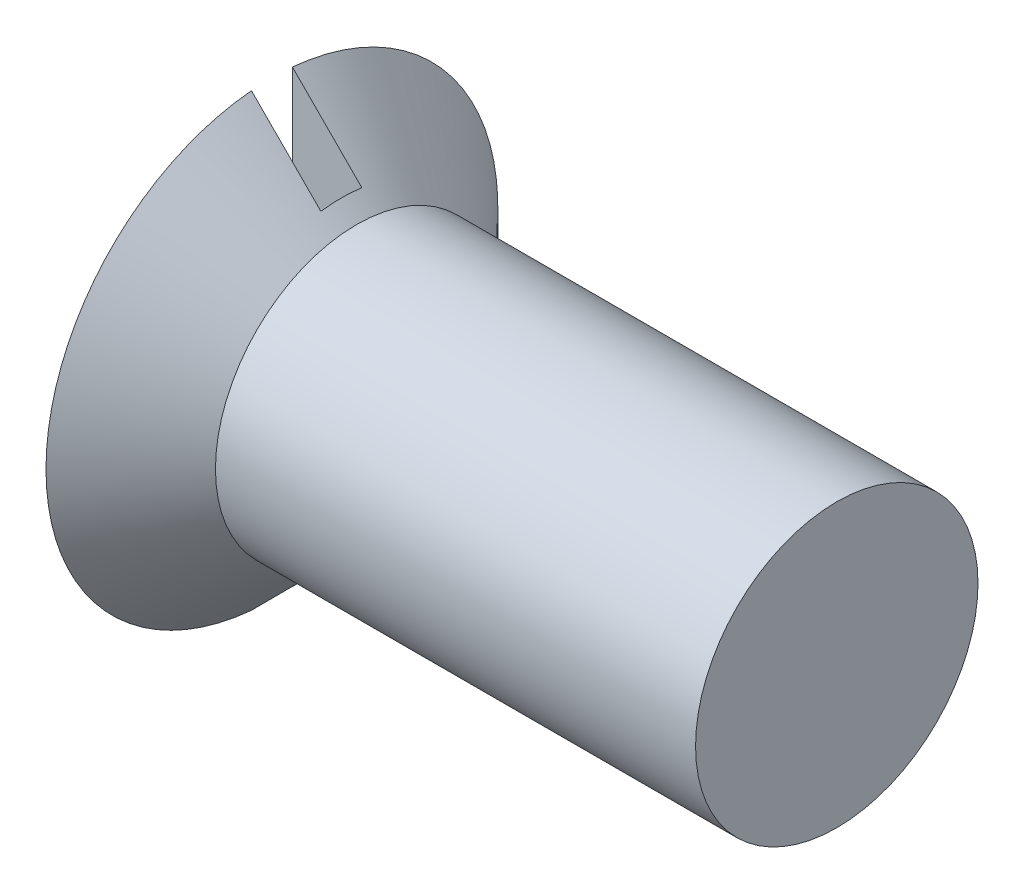
ISO-10303-21;
HEADER;
FILE_DESCRIPTION(('STEP AP214'),'2;1');
FILE_NAME('part.step','',(''),(''),'','','');
FILE_SCHEMA(('AUTOMOTIVE_DESIGN { 1 0 10303 214 1 1 1 1 }'));
ENDSEC;
DATA;
#1=APPLICATION_CONTEXT('core data for automotive mechanical design processes');
#2=APPLICATION_PROTOCOL_DEFINITION('international standard','automotive_design',2000,#1);
#3=PRODUCT_CONTEXT('',#1,'mechanical');
#4=PRODUCT('Part','Part','',(#3));
#5=PRODUCT_RELATED_PRODUCT_CATEGORY('part','',(#4));
#6=PRODUCT_DEFINITION_FORMATION('','',#4);
#7=PRODUCT_DEFINITION_CONTEXT('part definition',#1,'design');
#8=PRODUCT_DEFINITION('design','',#6,#7);
#9=PRODUCT_DEFINITION_SHAPE('','',#8);
#10=(LENGTH_UNIT() NAMED_UNIT(*) SI_UNIT(.MILLI.,.METRE.));
#11=(NAMED_UNIT(*) PLANE_ANGLE_UNIT() SI_UNIT($,.RADIAN.));
#12=(NAMED_UNIT(*) SI_UNIT($,.STERADIAN.) SOLID_ANGLE_UNIT());
#13=UNCERTAINTY_MEASURE_WITH_UNIT(LENGTH_MEASURE(1.E-05),#10,'distance_accuracy_value','');
#14=(GEOMETRIC_REPRESENTATION_CONTEXT(3) GLOBAL_UNCERTAINTY_ASSIGNED_CONTEXT((#13)) GLOBAL_UNIT_ASSIGNED_CONTEXT((#10,
#11,#12)) REPRESENTATION_CONTEXT('',''));
#15=CARTESIAN_POINT('',(0.,0.,0.));
#16=DIRECTION('',(0.,0.,1.));
#17=DIRECTION('',(1.,0.,0.));
#18=AXIS2_PLACEMENT_3D('',#15,#16,#17);
#19=CARTESIAN_POINT('',(0.,5.08,0.));
#20=DIRECTION('',(1.,0.,0.));
#21=DIRECTION('',(0.,0.,-1.));
#22=AXIS2_PLACEMENT_3D('',#19,#20,#21);
#23=PLANE('',#22);
#24=CARTESIAN_POINT('',(0.,0.,0.));
#25=DIRECTION('',(-1.,0.,0.));
#26=DIRECTION('',(0.,0.,1.));
#27=AXIS2_PLACEMENT_3D('',#24,#25,#26);
#28=CIRCLE('',#27,5.08);
#29=CARTESIAN_POINT('',(0.,-5.05909323698833,0.460408100991862));
#30=VERTEX_POINT('',#29);
#31=CARTESIAN_POINT('',(0.,5.05909323698833,0.460408100991862));
#32=VERTEX_POINT('',#31);
#33=EDGE_CURVE('E128',#30,#32,#28,.T.);
#34=ORIENTED_EDGE('',*,*,#33,.T.);
#35=DIRECTION('',(0.,-1.,0.));
#36=VECTOR('',#35,1.);
#37=CARTESIAN_POINT('',(0.,5.08,0.460408100991862));
#38=LINE('',#37,#36);
#39=EDGE_CURVE('E129',#32,#30,#38,.T.);
#40=ORIENTED_EDGE('',*,*,#39,.T.);
#41=EDGE_LOOP('',(#34,#40));
#42=FACE_BOUND('',#41,.T.);
#43=ADVANCED_FACE('F34',(#42),#23,.F.);
#44=CARTESIAN_POINT('',(0.,5.05909323698833,-0.460408100991862));
#45=VERTEX_POINT('',#44);
#46=CARTESIAN_POINT('',(0.,-5.05909323698833,-0.460408100991862));
#47=VERTEX_POINT('',#46);
#48=EDGE_CURVE('E130',#45,#47,#28,.T.);
#49=ORIENTED_EDGE('',*,*,#48,.T.);
#50=DIRECTION('',(0.,1.,0.));
#51=VECTOR('',#50,1.);
#52=CARTESIAN_POINT('',(0.,5.08,-0.460408100991862));
#53=LINE('',#52,#51);
#54=EDGE_CURVE('E55',#47,#45,#53,.T.);
#55=ORIENTED_EDGE('',*,*,#54,.T.);
#56=EDGE_LOOP('',(#49,#55));
#57=FACE_BOUND('',#56,.T.);
#58=ADVANCED_FACE('F36',(#57),#23,.F.);
#59=CARTESIAN_POINT('',(12.7,0.,0.));
#60=DIRECTION('',(-1.,0.,0.));
#61=DIRECTION('',(0.,0.,1.));
#62=AXIS2_PLACEMENT_3D('',#59,#60,#61);
#63=PLANE('',#62);
#64=CARTESIAN_POINT('',(12.7,0.,0.));
#65=DIRECTION('',(-1.,0.,0.));
#66=DIRECTION('',(0.,0.,1.));
#67=AXIS2_PLACEMENT_3D('',#64,#65,#66);
#68=CIRCLE('',#67,3.175);
#69=CARTESIAN_POINT('',(12.7,0.,3.175));
#70=VERTEX_POINT('',#69);
#71=EDGE_CURVE('E89',#70,#70,#68,.T.);
#72=ORIENTED_EDGE('',*,*,#71,.F.);
#73=EDGE_LOOP('',(#72));
#74=FACE_BOUND('',#73,.T.);
#75=ADVANCED_FACE('F125',(#74),#63,.F.);
#76=CARTESIAN_POINT('',(0.,0.,0.));
#77=DIRECTION('',(-1.,0.,0.));
#78=DIRECTION('',(0.,0.,1.));
#79=AXIS2_PLACEMENT_3D('',#76,#77,#78);
#80=CYLINDRICAL_SURFACE('',#79,3.175);
#81=CARTESIAN_POINT('',(1.905,0.,0.));
#82=DIRECTION('',(-1.,0.,0.));
#83=DIRECTION('',(0.,0.,1.));
#84=AXIS2_PLACEMENT_3D('',#81,#82,#83);
#85=CIRCLE('',#84,3.17499999999999);
#86=CARTESIAN_POINT('',(1.905,0.,3.17499999999999));
#87=VERTEX_POINT('',#86);
#88=EDGE_CURVE('E132',#87,#87,#85,.T.);
#89=ORIENTED_EDGE('',*,*,#88,.F.);
#90=EDGE_LOOP('',(#89));
#91=FACE_BOUND('',#90,.T.);
#92=ORIENTED_EDGE('',*,*,#71,.T.);
#93=EDGE_LOOP('',(#92));
#94=FACE_BOUND('',#93,.T.);
#95=ADVANCED_FACE('F119',(#91,#94),#80,.T.);
#96=CARTESIAN_POINT('',(1.905,0.,0.));
#97=DIRECTION('',(-1.,0.,0.));
#98=DIRECTION('',(0.,0.,1.));
#99=AXIS2_PLACEMENT_3D('',#96,#97,#98);
#100=CONICAL_SURFACE('',#99,3.17499999999999,0.78539816339745);
#101=CARTESIAN_POINT('',(1.55955971614929,0.,0.));
#102=DIRECTION('',(1.,0.,0.));
#103=DIRECTION('',(0.,0.,-1.));
#104=AXIS2_PLACEMENT_3D('',#101,#102,#103);
#105=CIRCLE('',#104,3.5204402838507);
#106=CARTESIAN_POINT('',(1.55955971614929,3.49020403023947,-0.460408100991862));
#107=VERTEX_POINT('',#106);
#108=CARTESIAN_POINT('',(1.55955971614929,3.49020403023947,0.460408100991862));
#109=VERTEX_POINT('',#108);
#110=EDGE_CURVE('E48',#107,#109,#105,.T.);
#111=ORIENTED_EDGE('',*,*,#110,.T.);
#112=CARTESIAN_POINT('',(-6.16759957704743,-11.2381724771485,0.460408100991862));
#113=CARTESIAN_POINT('',(-5.7784119867717,-10.8486556532235,0.460408100991862));
#114=CARTESIAN_POINT('',(-5.3892387700687,-10.4591244622243,0.460408100991862));
#115=CARTESIAN_POINT('',(-4.61093896086825,-9.68001314754672,0.460408100991862));
#116=CARTESIAN_POINT('',(-4.22181236851561,-9.2904330237236,0.460408100991862));
#117=CARTESIAN_POINT('',(-3.44359906342399,-8.51117898866716,0.460408100991862));
#118=CARTESIAN_POINT('',(-3.05451235532124,-8.12150507280372,0.460408100991862));
#119=CARTESIAN_POINT('',(-2.27644162031222,-7.3420570199807,0.460408100991862));
#120=CARTESIAN_POINT('',(-1.88745759310645,-6.95228288332012,0.460408100991862));
#121=CARTESIAN_POINT('',(-1.11190208062278,-6.17482055208817,0.460408100991862));
#122=CARTESIAN_POINT('',(-0.725329637753959,-5.78713331270981,0.460408100991862));
#123=CARTESIAN_POINT('',(0.0475349379208825,-5.01147268435745,0.460408100991862));
#124=CARTESIAN_POINT('',(0.433827068284316,-4.62349929294801,0.460408100991862));
#125=CARTESIAN_POINT('',(1.01280798322811,-4.04110120514328,0.460408100991862));
#126=CARTESIAN_POINT('',(1.20572125718688,-3.84689969740992,0.460408100991862));
#127=CARTESIAN_POINT('',(1.59131204025218,-3.45826123068062,0.460408100991862));
#128=CARTESIAN_POINT('',(1.78398954854388,-3.26382427087552,0.460408100991862));
#129=CARTESIAN_POINT('',(2.16894415175285,-2.87456066094923,0.460408100991862));
#130=CARTESIAN_POINT('',(2.3612212529949,-2.67973401708021,0.460408100991862));
#131=CARTESIAN_POINT('',(2.74506510097304,-2.28938251795239,0.460408100991862));
#132=CARTESIAN_POINT('',(2.93663185314031,-2.09385766805446,0.460408100991862));
#133=CARTESIAN_POINT('',(3.17971244123445,-1.84371016327747,0.460408100991862));
#134=CARTESIAN_POINT('',(3.23197070990426,-1.78981143164895,0.460408100991862));
#135=CARTESIAN_POINT('',(3.33632195024125,-1.68185375060645,0.460408100991862));
#136=CARTESIAN_POINT('',(3.3884149213582,-1.62779480066031,0.460408100991862));
#137=CARTESIAN_POINT('',(3.49242927847795,-1.51941988841599,0.460408100991862));
#138=CARTESIAN_POINT('',(3.54435047149384,-1.46510374079834,0.460408100991862));
#139=CARTESIAN_POINT('',(3.64789277407434,-1.35618633215652,0.460408100991862));
#140=CARTESIAN_POINT('',(3.69951388566574,-1.30158507306279,0.460408100991862));
#141=CARTESIAN_POINT('',(3.8197744640083,-1.17338946379339,0.460408100991862));
#142=CARTESIAN_POINT('',(3.88824523703887,-1.09963686784403,0.460408100991862));
#143=CARTESIAN_POINT('',(4.02379587684333,-0.951074370710247,0.460408100991862));
#144=CARTESIAN_POINT('',(4.09087787413187,-0.876266439410587,0.460408100991862));
#145=CARTESIAN_POINT('',(4.19901572297908,-0.751490592309714,0.460408100991862));
#146=CARTESIAN_POINT('',(4.2408233820252,-0.702175910638047,0.460408100991862));
#147=CARTESIAN_POINT('',(4.32284224156223,-0.601810747087484,0.460408100991862));
#148=CARTESIAN_POINT('',(4.3630449299683,-0.550753141964238,0.460408100991862));
#149=CARTESIAN_POINT('',(4.4209325333439,-0.471920279895036,0.460408100991862));
#150=CARTESIAN_POINT('',(4.43992473391601,-0.445112263829037,0.460408100991862));
#151=CARTESIAN_POINT('',(4.47659166252188,-0.390560520251965,0.460408100991862));
#152=CARTESIAN_POINT('',(4.4942650970993,-0.362815911865659,0.460408100991862));
#153=CARTESIAN_POINT('',(4.52747836810241,-0.306307005868655,0.460408100991862));
#154=CARTESIAN_POINT('',(4.54303187016757,-0.277550906166514,0.460408100991862));
#155=CARTESIAN_POINT('',(4.57100051735079,-0.218579898386271,0.460408100991862));
#156=CARTESIAN_POINT('',(4.58342284205831,-0.188368520338824,0.460408100991862));
#157=CARTESIAN_POINT('',(4.60331638465681,-0.126805252346718,0.460408100991862));
#158=CARTESIAN_POINT('',(4.61086461470696,-0.095479797355971,0.460408100991862));
#159=CARTESIAN_POINT('',(4.61953053864308,-0.0320460520175875,0.460408100991862));
#160=CARTESIAN_POINT('',(4.62068175534835,5.72701904688987E-05,0.460408100991862));
#161=CARTESIAN_POINT('',(4.61629661370954,0.063711312619772,0.460408100991862));
#162=CARTESIAN_POINT('',(4.61077100753414,0.0952628385191108,0.460408100991862));
#163=CARTESIAN_POINT('',(4.59445994772262,0.157089291990153,0.460408100991862));
#164=CARTESIAN_POINT('',(4.58364116806406,0.187354792807354,0.460408100991862));
#165=CARTESIAN_POINT('',(4.5542161053928,0.256448685947123,0.460408100991862));
#166=CARTESIAN_POINT('',(4.53421164865229,0.294657447522127,0.460408100991862));
#167=CARTESIAN_POINT('',(4.4906992263566,0.369062990790539,0.460408100991862));
#168=CARTESIAN_POINT('',(4.4671816958368,0.405253897122974,0.460408100991862));
#169=CARTESIAN_POINT('',(4.41793960528131,0.476456488218595,0.460408100991862));
#170=CARTESIAN_POINT('',(4.39220081035695,0.511458200641449,0.460408100991862));
#171=CARTESIAN_POINT('',(4.33947830020312,0.580420040686141,0.460408100991862));
#172=CARTESIAN_POINT('',(4.31249639088604,0.614381566928726,0.460408100991862));
#173=CARTESIAN_POINT('',(4.25299046907636,0.687379173372127,0.460408100991862));
#174=CARTESIAN_POINT('',(4.22030954870873,0.726286718146369,0.460408100991862));
#175=CARTESIAN_POINT('',(4.15419024328488,0.803454604731398,0.460408100991862));
#176=CARTESIAN_POINT('',(4.12075179066361,0.84171488827649,0.460408100991862));
#177=CARTESIAN_POINT('',(4.01965246432327,0.955837308105514,0.460408100991862));
#178=CARTESIAN_POINT('',(3.95122583870824,1.03101930294387,0.460408100991862));
#179=CARTESIAN_POINT('',(3.81322094348089,1.18048983900892,0.460408100991862));
#180=CARTESIAN_POINT('',(3.74364129597729,1.25477709571764,0.460408100991862));
#181=CARTESIAN_POINT('',(3.60384592027768,1.40272656036384,0.460408100991862));
#182=CARTESIAN_POINT('',(3.53363030175075,1.47638887198036,0.460408100991862));
#183=CARTESIAN_POINT('',(3.39316683740419,1.6229172288353,0.460408100991862));
#184=CARTESIAN_POINT('',(3.32292123097084,1.69578542589778,0.460408100991862));
#185=CARTESIAN_POINT('',(3.18214528628746,1.84125235809043,0.460408100991862));
#186=CARTESIAN_POINT('',(3.11161493555662,1.91385108113543,0.460408100991862));
#187=CARTESIAN_POINT('',(2.89982305932339,2.13126258434928,0.460408100991862));
#188=CARTESIAN_POINT('',(2.75826684227279,2.27578810922424,0.460408100991862));
#189=CARTESIAN_POINT('',(2.47483027457952,2.56430172122673,0.460408100991862));
#190=CARTESIAN_POINT('',(2.33295025723575,2.70829013636859,0.460408100991862));
#191=CARTESIAN_POINT('',(2.04891788455687,2.99599818848075,0.460408100991862));
#192=CARTESIAN_POINT('',(1.90676552909126,3.13971782532219,0.460408100991862));
#193=CARTESIAN_POINT('',(1.48004407898709,3.57061952591904,0.460408100991862));
#194=CARTESIAN_POINT('',(1.19521295471136,3.85754199102035,0.460408100991862));
#195=CARTESIAN_POINT('',(0.625136199464497,4.43111735381693,0.460408100991862));
#196=CARTESIAN_POINT('',(0.339890482572417,4.71777016604156,0.460408100991862));
#197=CARTESIAN_POINT('',(-0.230802850103447,5.29087294589003,0.460408100991862));
#198=CARTESIAN_POINT('',(-0.51625046525227,5.57732291414618,0.460408100991862));
#199=CARTESIAN_POINT('',(-1.37359098569651,6.43730629424596,0.460408100991862));
#200=CARTESIAN_POINT('',(-1.94566820840955,7.01065591931271,0.460408100991862));
#201=CARTESIAN_POINT('',(-3.0900104524797,8.15709762223212,0.460408100991862));
#202=CARTESIAN_POINT('',(-3.66227546020379,8.7301897136971,0.460408100991862));
#203=CARTESIAN_POINT('',(-4.39571942885791,9.46453088890552,0.460408100991862));
#204=CARTESIAN_POINT('',(-4.5568399017116,9.62583838916599,0.460408100991862));
#205=CARTESIAN_POINT('',(-4.87909145357073,9.94844635391253,0.460408100991862));
#206=CARTESIAN_POINT('',(-5.04022253267364,10.1097468183012,0.460408100991862));
#207=CARTESIAN_POINT('',(-5.36239170240464,10.4322394952848,0.460408100991862));
#208=CARTESIAN_POINT('',(-5.52342978830001,10.5934317126077,0.460408100991862));
#209=CARTESIAN_POINT('',(-5.84551082356545,10.9158077298135,0.460408100991862));
#210=CARTESIAN_POINT('',(-6.00655377286214,11.0769915297698,0.460408100991862));
#211=CARTESIAN_POINT('',(-6.16759957704743,11.2381724771485,0.460408100991862));
#212=B_SPLINE_CURVE_WITH_KNOTS('',3,(#112,#113,#114,#115,#116,#117,#118,#119,#120,#121,#122,
#123,#124,#125,#126,#127,#128,#129,#130,#131,#132,#133,#134,#135,#136,#137,#138,#139,#140,#141,
#142,#143,#144,#145,#146,#147,#148,#149,#150,#151,#152,#153,#154,#155,#156,#157,#158,#159,#160,
#161,#162,#163,#164,#165,#166,#167,#168,#169,#170,#171,#172,#173,#174,#175,#176,#177,#178,#179,
#180,#181,#182,#183,#184,#185,#186,#187,#188,#189,#190,#191,#192,#193,#194,#195,#196,#197,#198,
#199,#200,#201,#202,#203,#204,#205,#206,#207,#208,#209,#210,#211),.UNSPECIFIED.,.F.,.F.,(4,2,2,
2,2,2,2,2,2,2,2,2,2,2,2,2,2,2,2,2,2,2,2,2,2,2,2,2,2,2,2,2,2,2,2,2,2,2,2,2,2,2,2,2,2,2,2,2,2,4),
(0.,1.65188166918257,3.30376834265117,4.95576955882663,6.60776590222851,8.25022039598537,
9.8926890338796,10.7138879721206,11.5350897405854,12.3562784375493,13.1774608428755,
13.4026804682467,13.6279008425349,13.8533208215778,14.0787392763232,14.3806443087492,
14.6820455080052,14.8759845811641,15.070843465969,15.1693787760427,15.2680094935276,
15.3659708560644,15.4637055131915,15.5598554862909,15.6555011178248,15.7509929293654,
15.8470938519163,15.9761258281661,16.1055157454686,16.2358071246333,16.3659148519458,
16.5183347983301,16.6707683931428,16.9757205706184,17.2810680572387,17.586363854875,
17.8900041674279,18.1936579367539,18.8005596504609,19.4069942879393,20.0134292161025,
21.2263091336527,22.4394927002212,23.6526724681971,26.0824910791701,28.5121610128582,
29.1961341462056,29.8801148329137,30.5636686084357,31.2472148319371),.UNSPECIFIED.);
#213=EDGE_CURVE('E11',#109,#32,#212,.T.);
#214=ORIENTED_EDGE('',*,*,#213,.T.);
#215=ORIENTED_EDGE('',*,*,#33,.F.);
#216=CARTESIAN_POINT('',(1.55955971614929,-3.49020403023947,0.460408100991862));
#217=VERTEX_POINT('',#216);
#218=EDGE_CURVE('E38',#30,#217,#212,.T.);
#219=ORIENTED_EDGE('',*,*,#218,.T.);
#220=CARTESIAN_POINT('',(1.55955971614929,-3.49020403023947,-0.460408100991862));
#221=VERTEX_POINT('',#220);
#222=EDGE_CURVE('E88',#217,#221,#105,.T.);
#223=ORIENTED_EDGE('',*,*,#222,.T.);
#224=CARTESIAN_POINT('',(-6.16759957704743,11.2381724771485,-0.460408100991862));
#225=CARTESIAN_POINT('',(-5.7784119867717,10.8486556532235,-0.460408100991862));
#226=CARTESIAN_POINT('',(-5.3892387700687,10.4591244622243,-0.460408100991862));
#227=CARTESIAN_POINT('',(-4.61093896086825,9.68001314754672,-0.460408100991862));
#228=CARTESIAN_POINT('',(-4.22181236851561,9.2904330237236,-0.460408100991862));
#229=CARTESIAN_POINT('',(-3.44359906342399,8.51117898866716,-0.460408100991862));
#230=CARTESIAN_POINT('',(-3.05451235532124,8.12150507280372,-0.460408100991862));
#231=CARTESIAN_POINT('',(-2.27644162031221,7.3420570199807,-0.460408100991862));
#232=CARTESIAN_POINT('',(-1.88745759310644,6.95228288332012,-0.460408100991862));
#233=CARTESIAN_POINT('',(-1.11190208062278,6.17482055208817,-0.460408100991862));
#234=CARTESIAN_POINT('',(-0.725329637753955,5.7871333127098,-0.460408100991862));
#235=CARTESIAN_POINT('',(0.0475349379208846,5.01147268435745,-0.460408100991862));
#236=CARTESIAN_POINT('',(0.433827068284318,4.623499292948,-0.460408100991862));
#237=CARTESIAN_POINT('',(1.01280798322811,4.04110120514328,-0.460408100991862));
#238=CARTESIAN_POINT('',(1.20572125718688,3.84689969740992,-0.460408100991862));
#239=CARTESIAN_POINT('',(1.59131204025218,3.45826123068062,-0.460408100991862));
#240=CARTESIAN_POINT('',(1.78398954854388,3.26382427087552,-0.460408100991862));
#241=CARTESIAN_POINT('',(2.16894415175285,2.87456066094923,-0.460408100991862));
#242=CARTESIAN_POINT('',(2.3612212529949,2.67973401708021,-0.460408100991862));
#243=CARTESIAN_POINT('',(2.74506510097304,2.28938251795239,-0.460408100991862));
#244=CARTESIAN_POINT('',(2.93663185314031,2.09385766805446,-0.460408100991862));
#245=CARTESIAN_POINT('',(3.17971244123445,1.84371016327747,-0.460408100991862));
#246=CARTESIAN_POINT('',(3.23197070990426,1.78981143164895,-0.460408100991862));
#247=CARTESIAN_POINT('',(3.33632195024125,1.68185375060645,-0.460408100991862));
#248=CARTESIAN_POINT('',(3.3884149213582,1.62779480066031,-0.460408100991862));
#249=CARTESIAN_POINT('',(3.49242927847795,1.51941988841599,-0.460408100991862));
#250=CARTESIAN_POINT('',(3.54435047149384,1.46510374079834,-0.460408100991862));
#251=CARTESIAN_POINT('',(3.64789277407434,1.35618633215652,-0.460408100991862));
#252=CARTESIAN_POINT('',(3.69951388566574,1.30158507306279,-0.460408100991862));
#253=CARTESIAN_POINT('',(3.8197744640083,1.17338946379339,-0.460408100991862));
#254=CARTESIAN_POINT('',(3.88824523703887,1.09963686784403,-0.460408100991862));
#255=CARTESIAN_POINT('',(4.02379587684333,0.951074370710247,-0.460408100991862));
#256=CARTESIAN_POINT('',(4.09087787413187,0.876266439410587,-0.460408100991862));
#257=CARTESIAN_POINT('',(4.19901572297908,0.751490592309714,-0.460408100991862));
#258=CARTESIAN_POINT('',(4.2408233820252,0.702175910638047,-0.460408100991862));
#259=CARTESIAN_POINT('',(4.32284224156223,0.601810747087484,-0.460408100991862));
#260=CARTESIAN_POINT('',(4.3630449299683,0.550753141964238,-0.460408100991862));
#261=CARTESIAN_POINT('',(4.42093253334391,0.471920279895035,-0.460408100991862));
#262=CARTESIAN_POINT('',(4.43992473391602,0.445112263829035,-0.460408100991862));
#263=CARTESIAN_POINT('',(4.47659166252188,0.390560520251963,-0.460408100991862));
#264=CARTESIAN_POINT('',(4.4942650970993,0.362815911865658,-0.460408100991862));
#265=CARTESIAN_POINT('',(4.52747836810241,0.306307005868654,-0.460408100991862));
#266=CARTESIAN_POINT('',(4.54303187016757,0.277550906166513,-0.460408100991862));
#267=CARTESIAN_POINT('',(4.57100051735079,0.218579898386269,-0.460408100991862));
#268=CARTESIAN_POINT('',(4.58342284205831,0.188368520338823,-0.460408100991862));
#269=CARTESIAN_POINT('',(4.60331638465681,0.126805252346717,-0.460408100991862));
#270=CARTESIAN_POINT('',(4.61086461470696,0.0954797973559702,-0.460408100991862));
#271=CARTESIAN_POINT('',(4.61953053864308,0.0320460520175866,-0.460408100991862));
#272=CARTESIAN_POINT('',(4.62068175534835,-5.72701904701185E-05,-0.460408100991862));
#273=CARTESIAN_POINT('',(4.61629661370954,-0.0637113126197747,-0.460408100991862));
#274=CARTESIAN_POINT('',(4.61077100753414,-0.0952628385191147,-0.460408100991862));
#275=CARTESIAN_POINT('',(4.59445994772262,-0.157089291990157,-0.460408100991862));
#276=CARTESIAN_POINT('',(4.58364116806406,-0.187354792807356,-0.460408100991862));
#277=CARTESIAN_POINT('',(4.5542161053928,-0.256448685947125,-0.460408100991862));
#278=CARTESIAN_POINT('',(4.53421164865229,-0.29465744752213,-0.460408100991862));
#279=CARTESIAN_POINT('',(4.49069922635659,-0.369062990790542,-0.460408100991862));
#280=CARTESIAN_POINT('',(4.46718169583679,-0.405253897122978,-0.460408100991862));
#281=CARTESIAN_POINT('',(4.4179396052813,-0.476456488218599,-0.460408100991862));
#282=CARTESIAN_POINT('',(4.39220081035695,-0.511458200641453,-0.460408100991862));
#283=CARTESIAN_POINT('',(4.33947830020312,-0.580420040686146,-0.460408100991862));
#284=CARTESIAN_POINT('',(4.31249639088604,-0.614381566928731,-0.460408100991862));
#285=CARTESIAN_POINT('',(4.25299046907636,-0.687379173372133,-0.460408100991862));
#286=CARTESIAN_POINT('',(4.22030954870872,-0.726286718146376,-0.460408100991862));
#287=CARTESIAN_POINT('',(4.15419024328487,-0.803454604731406,-0.460408100991862));
#288=CARTESIAN_POINT('',(4.1207517906636,-0.841714888276499,-0.460408100991862));
#289=CARTESIAN_POINT('',(4.01965246432326,-0.955837308105525,-0.460408100991862));
#290=CARTESIAN_POINT('',(3.95122583870823,-1.03101930294388,-0.460408100991862));
#291=CARTESIAN_POINT('',(3.81322094348088,-1.18048983900894,-0.460408100991862));
#292=CARTESIAN_POINT('',(3.74364129597727,-1.25477709571766,-0.460408100991862));
#293=CARTESIAN_POINT('',(3.60384592027766,-1.40272656036386,-0.460408100991862));
#294=CARTESIAN_POINT('',(3.53363030175074,-1.47638887198037,-0.460408100991862));
#295=CARTESIAN_POINT('',(3.39316683740417,-1.62291722883532,-0.460408100991862));
#296=CARTESIAN_POINT('',(3.32292123097082,-1.6957854258978,-0.460408100991862));
#297=CARTESIAN_POINT('',(3.18214528628744,-1.84125235809045,-0.460408100991862));
#298=CARTESIAN_POINT('',(3.1116149355566,-1.91385108113545,-0.460408100991862));
#299=CARTESIAN_POINT('',(2.89982305932337,-2.1312625843493,-0.460408100991862));
#300=CARTESIAN_POINT('',(2.75826684227276,-2.27578810922427,-0.460408100991862));
#301=CARTESIAN_POINT('',(2.4748302745795,-2.56430172122675,-0.460408100991862));
#302=CARTESIAN_POINT('',(2.33295025723572,-2.70829013636861,-0.460408100991862));
#303=CARTESIAN_POINT('',(2.04891788455684,-2.99599818848078,-0.460408100991862));
#304=CARTESIAN_POINT('',(1.90676552909122,-3.13971782532222,-0.460408100991862));
#305=CARTESIAN_POINT('',(1.48004407898705,-3.57061952591907,-0.460408100991862));
#306=CARTESIAN_POINT('',(1.19521295471132,-3.85754199102039,-0.460408100991862));
#307=CARTESIAN_POINT('',(0.625136199464451,-4.43111735381698,-0.460408100991862));
#308=CARTESIAN_POINT('',(0.339890482572368,-4.71777016604161,-0.460408100991862));
#309=CARTESIAN_POINT('',(-0.230802850103504,-5.29087294589008,-0.460408100991862));
#310=CARTESIAN_POINT('',(-0.516250465252331,-5.57732291414624,-0.460408100991862));
#311=CARTESIAN_POINT('',(-1.37359098569658,-6.43730629424604,-0.460408100991862));
#312=CARTESIAN_POINT('',(-1.94566820840963,-7.01065591931279,-0.460408100991862));
#313=CARTESIAN_POINT('',(-3.09001045247979,-8.15709762223221,-0.460408100991862));
#314=CARTESIAN_POINT('',(-3.66227546020389,-8.73018971369719,-0.460408100991862));
#315=CARTESIAN_POINT('',(-4.395719428858,-9.46453088890561,-0.460408100991862));
#316=CARTESIAN_POINT('',(-4.55683990171169,-9.62583838916608,-0.460408100991862));
#317=CARTESIAN_POINT('',(-4.8790914535708,-9.9484463539126,-0.460408100991862));
#318=CARTESIAN_POINT('',(-5.0402225326737,-10.1097468183013,-0.460408100991862));
#319=CARTESIAN_POINT('',(-5.36239170240469,-10.4322394952848,-0.460408100991862));
#320=CARTESIAN_POINT('',(-5.52342978830004,-10.5934317126077,-0.460408100991862));
#321=CARTESIAN_POINT('',(-5.84551082356547,-10.9158077298135,-0.460408100991862));
#322=CARTESIAN_POINT('',(-6.00655377286215,-11.0769915297698,-0.460408100991862));
#323=CARTESIAN_POINT('',(-6.16759957704743,-11.2381724771485,-0.460408100991862));
#324=B_SPLINE_CURVE_WITH_KNOTS('',3,(#224,#225,#226,#227,#228,#229,#230,#231,#232,#233,#234,
#235,#236,#237,#238,#239,#240,#241,#242,#243,#244,#245,#246,#247,#248,#249,#250,#251,#252,#253,
#254,#255,#256,#257,#258,#259,#260,#261,#262,#263,#264,#265,#266,#267,#268,#269,#270,#271,#272,
#273,#274,#275,#276,#277,#278,#279,#280,#281,#282,#283,#284,#285,#286,#287,#288,#289,#290,#291,
#292,#293,#294,#295,#296,#297,#298,#299,#300,#301,#302,#303,#304,#305,#306,#307,#308,#309,#310,
#311,#312,#313,#314,#315,#316,#317,#318,#319,#320,#321,#322,#323),.UNSPECIFIED.,.F.,.F.,(4,2,2,
2,2,2,2,2,2,2,2,2,2,2,2,2,2,2,2,2,2,2,2,2,2,2,2,2,2,2,2,2,2,2,2,2,2,2,2,2,2,2,2,2,2,2,2,2,2,4),
(0.,1.65188166918258,3.30376834265117,4.95576955882663,6.60776590222851,8.25022039598538,
9.8926890338796,10.7138879721206,11.5350897405854,12.3562784375493,13.1774608428755,
13.4026804682467,13.627900842535,13.8533208215778,14.0787392763232,14.3806443087492,
14.6820455080052,14.8759845811641,15.070843465969,15.1693787760427,15.2680094935276,
15.3659708560644,15.4637055131915,15.5598554862909,15.6555011178249,15.7509929293654,
15.8470938519163,15.9761258281661,16.1055157454686,16.2358071246333,16.3659148519458,
16.5183347983301,16.6707683931428,16.9757205706184,17.2810680572388,17.5863638548751,
17.890004167428,18.1936579367539,18.800559650461,19.4069942879393,20.0134292161026,
21.2263091336527,22.4394927002213,23.6526724681972,26.0824910791702,28.5121610128584,
29.1961341462058,29.8801148329138,30.5636686084357,31.2472148319371),.UNSPECIFIED.);
#325=EDGE_CURVE('E79',#221,#47,#324,.T.);
#326=ORIENTED_EDGE('',*,*,#325,.T.);
#327=ORIENTED_EDGE('',*,*,#48,.F.);
#328=EDGE_CURVE('E91',#45,#107,#324,.T.);
#329=ORIENTED_EDGE('',*,*,#328,.T.);
#330=EDGE_LOOP('',(#111,#214,#215,#219,#223,#326,#327,#329));
#331=FACE_BOUND('',#330,.T.);
#332=ORIENTED_EDGE('',*,*,#88,.T.);
#333=EDGE_LOOP('',(#332));
#334=FACE_BOUND('',#333,.T.);
#335=ADVANCED_FACE('F98',(#331,#334),#100,.T.);
#336=CARTESIAN_POINT('',(1.55955971614929,-7.874,-0.460408100991862));
#337=DIRECTION('',(1.,0.,0.));
#338=DIRECTION('',(0.,0.,-1.));
#339=AXIS2_PLACEMENT_3D('',#336,#337,#338);
#340=PLANE('',#339);
#341=DIRECTION('',(0.,1.,0.));
#342=VECTOR('',#341,1.);
#343=CARTESIAN_POINT('',(1.55955971614929,-7.874,-0.460408100991862));
#344=LINE('',#343,#342);
#345=EDGE_CURVE('E82',#221,#107,#344,.T.);
#346=ORIENTED_EDGE('',*,*,#345,.F.);
#347=ORIENTED_EDGE('',*,*,#222,.F.);
#348=DIRECTION('',(0.,1.,0.));
#349=VECTOR('',#348,1.);
#350=CARTESIAN_POINT('',(1.55955971614929,-7.874,0.460408100991862));
#351=LINE('',#350,#349);
#352=EDGE_CURVE('E96',#217,#109,#351,.T.);
#353=ORIENTED_EDGE('',*,*,#352,.T.);
#354=ORIENTED_EDGE('',*,*,#110,.F.);
#355=EDGE_LOOP('',(#346,#347,#353,#354));
#356=FACE_BOUND('',#355,.T.);
#357=ADVANCED_FACE('F93',(#356),#340,.F.);
#358=CARTESIAN_POINT('',(-1.55955971614929,-7.874,0.460408100991862));
#359=DIRECTION('',(0.,0.,1.));
#360=DIRECTION('',(1.,0.,0.));
#361=AXIS2_PLACEMENT_3D('',#358,#359,#360);
#362=PLANE('',#361);
#363=ORIENTED_EDGE('',*,*,#39,.F.);
#364=ORIENTED_EDGE('',*,*,#213,.F.);
#365=ORIENTED_EDGE('',*,*,#352,.F.);
#366=ORIENTED_EDGE('',*,*,#218,.F.);
#367=EDGE_LOOP('',(#363,#364,#365,#366));
#368=FACE_BOUND('',#367,.T.);
#369=ADVANCED_FACE('F112',(#368),#362,.F.);
#370=CARTESIAN_POINT('',(-1.55955971614929,-7.874,-0.460408100991862));
#371=DIRECTION('',(0.,0.,-1.));
#372=DIRECTION('',(-1.,0.,0.));
#373=AXIS2_PLACEMENT_3D('',#370,#371,#372);
#374=PLANE('',#373);
#375=ORIENTED_EDGE('',*,*,#54,.F.);
#376=ORIENTED_EDGE('',*,*,#325,.F.);
#377=ORIENTED_EDGE('',*,*,#345,.T.);
#378=ORIENTED_EDGE('',*,*,#328,.F.);
#379=EDGE_LOOP('',(#375,#376,#377,#378));
#380=FACE_BOUND('',#379,.T.);
#381=ADVANCED_FACE('F81',(#380),#374,.F.);
#382=CLOSED_SHELL('',(#43,#58,#75,#95,#335,#357,#369,#381));
#383=MANIFOLD_SOLID_BREP('B2',#382);
#384=ADVANCED_BREP_SHAPE_REPRESENTATION('',(#18,#383),#14);
#385=SHAPE_DEFINITION_REPRESENTATION(#9,#384);
ENDSEC;
END-ISO-10303-21;
